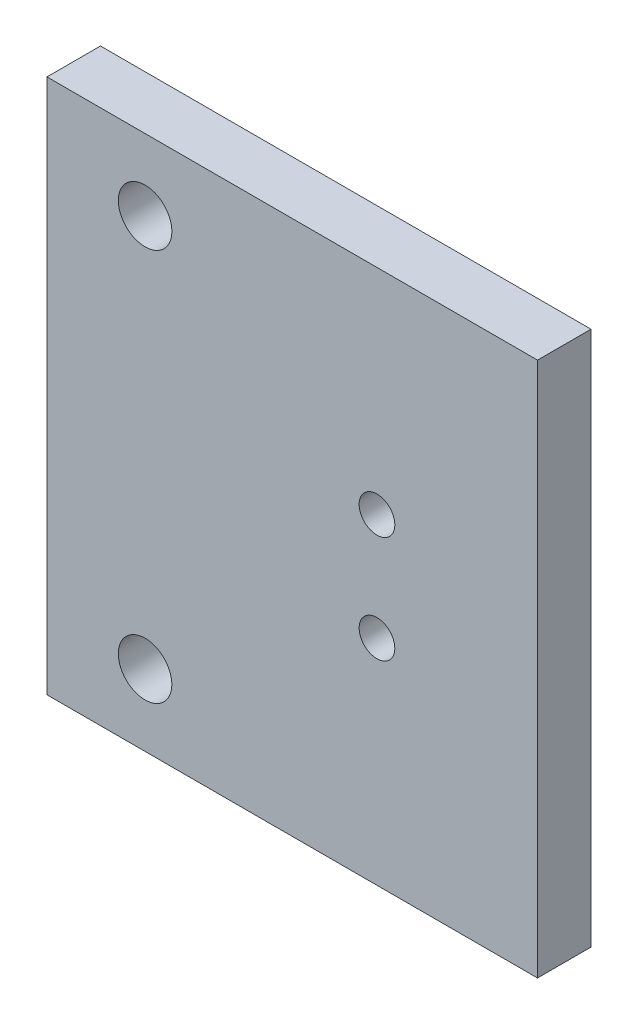
ISO-10303-21;
HEADER;
FILE_DESCRIPTION(('STEP AP214'),'2;1');
FILE_NAME('part.step','',(''),(''),'','','');
FILE_SCHEMA(('AUTOMOTIVE_DESIGN { 1 0 10303 214 1 1 1 1 }'));
ENDSEC;
DATA;
#1=APPLICATION_CONTEXT('core data for automotive mechanical design processes');
#2=APPLICATION_PROTOCOL_DEFINITION('international standard','automotive_design',2000,#1);
#3=PRODUCT_CONTEXT('',#1,'mechanical');
#4=PRODUCT('Part','Part','',(#3));
#5=PRODUCT_RELATED_PRODUCT_CATEGORY('part','',(#4));
#6=PRODUCT_DEFINITION_FORMATION('','',#4);
#7=PRODUCT_DEFINITION_CONTEXT('part definition',#1,'design');
#8=PRODUCT_DEFINITION('design','',#6,#7);
#9=PRODUCT_DEFINITION_SHAPE('','',#8);
#10=(LENGTH_UNIT() NAMED_UNIT(*) SI_UNIT(.MILLI.,.METRE.));
#11=(NAMED_UNIT(*) PLANE_ANGLE_UNIT() SI_UNIT($,.RADIAN.));
#12=(NAMED_UNIT(*) SI_UNIT($,.STERADIAN.) SOLID_ANGLE_UNIT());
#13=UNCERTAINTY_MEASURE_WITH_UNIT(LENGTH_MEASURE(1.E-05),#10,'distance_accuracy_value','');
#14=(GEOMETRIC_REPRESENTATION_CONTEXT(3) GLOBAL_UNCERTAINTY_ASSIGNED_CONTEXT((#13)) GLOBAL_UNIT_ASSIGNED_CONTEXT((#10,
#11,#12)) REPRESENTATION_CONTEXT('',''));
#15=CARTESIAN_POINT('',(0.,0.,0.));
#16=DIRECTION('',(0.,0.,1.));
#17=DIRECTION('',(1.,0.,0.));
#18=AXIS2_PLACEMENT_3D('',#15,#16,#17);
#19=CARTESIAN_POINT('',(0.,0.,3.));
#20=DIRECTION('',(0.,0.,-1.));
#21=DIRECTION('',(-1.,0.,0.));
#22=AXIS2_PLACEMENT_3D('',#19,#20,#21);
#23=PLANE('',#22);
#24=DIRECTION('',(0.,-1.,0.));
#25=VECTOR('',#24,1.);
#26=CARTESIAN_POINT('',(0.,0.,3.));
#27=LINE('',#26,#25);
#28=CARTESIAN_POINT('',(0.,30.,3.));
#29=VERTEX_POINT('',#28);
#30=CARTESIAN_POINT('',(0.,0.,3.));
#31=VERTEX_POINT('',#30);
#32=EDGE_CURVE('E85',#29,#31,#27,.T.);
#33=ORIENTED_EDGE('',*,*,#32,.T.);
#34=DIRECTION('',(1.,0.,0.));
#35=VECTOR('',#34,1.);
#36=CARTESIAN_POINT('',(0.,0.,3.));
#37=LINE('',#36,#35);
#38=CARTESIAN_POINT('',(27.5,0.,3.));
#39=VERTEX_POINT('',#38);
#40=EDGE_CURVE('E80',#31,#39,#37,.T.);
#41=ORIENTED_EDGE('',*,*,#40,.T.);
#42=DIRECTION('',(0.,1.,0.));
#43=VECTOR('',#42,1.);
#44=CARTESIAN_POINT('',(27.5,0.,3.));
#45=LINE('',#44,#43);
#46=CARTESIAN_POINT('',(27.5,30.,3.));
#47=VERTEX_POINT('',#46);
#48=EDGE_CURVE('E83',#39,#47,#45,.T.);
#49=ORIENTED_EDGE('',*,*,#48,.T.);
#50=DIRECTION('',(-1.,0.,0.));
#51=VECTOR('',#50,1.);
#52=CARTESIAN_POINT('',(0.,30.,3.));
#53=LINE('',#52,#51);
#54=EDGE_CURVE('E50',#47,#29,#53,.T.);
#55=ORIENTED_EDGE('',*,*,#54,.T.);
#56=EDGE_LOOP('',(#33,#41,#49,#55));
#57=FACE_BOUND('',#56,.T.);
#58=CARTESIAN_POINT('',(18.5,12.,3.));
#59=DIRECTION('',(0.,0.,1.));
#60=DIRECTION('',(1.,0.,0.));
#61=AXIS2_PLACEMENT_3D('',#58,#59,#60);
#62=CIRCLE('',#61,1.);
#63=CARTESIAN_POINT('',(19.5,12.,3.));
#64=VERTEX_POINT('',#63);
#65=EDGE_CURVE('E100',#64,#64,#62,.T.);
#66=ORIENTED_EDGE('',*,*,#65,.F.);
#67=EDGE_LOOP('',(#66));
#68=FACE_BOUND('',#67,.T.);
#69=CARTESIAN_POINT('',(18.5,18.,3.));
#70=DIRECTION('',(0.,0.,1.));
#71=DIRECTION('',(1.,0.,0.));
#72=AXIS2_PLACEMENT_3D('',#69,#70,#71);
#73=CIRCLE('',#72,1.);
#74=CARTESIAN_POINT('',(19.5,18.,3.));
#75=VERTEX_POINT('',#74);
#76=EDGE_CURVE('E115',#75,#75,#73,.T.);
#77=ORIENTED_EDGE('',*,*,#76,.F.);
#78=EDGE_LOOP('',(#77));
#79=FACE_BOUND('',#78,.T.);
#80=CARTESIAN_POINT('',(5.5,4.,3.));
#81=DIRECTION('',(0.,0.,1.));
#82=DIRECTION('',(1.,0.,0.));
#83=AXIS2_PLACEMENT_3D('',#80,#81,#82);
#84=CIRCLE('',#83,1.5);
#85=CARTESIAN_POINT('',(7.,4.,3.));
#86=VERTEX_POINT('',#85);
#87=EDGE_CURVE('E121',#86,#86,#84,.T.);
#88=ORIENTED_EDGE('',*,*,#87,.F.);
#89=EDGE_LOOP('',(#88));
#90=FACE_BOUND('',#89,.T.);
#91=CARTESIAN_POINT('',(5.5,26.,3.));
#92=DIRECTION('',(0.,0.,1.));
#93=DIRECTION('',(-1.,0.,0.));
#94=AXIS2_PLACEMENT_3D('',#91,#92,#93);
#95=CIRCLE('',#94,1.5);
#96=CARTESIAN_POINT('',(4.,26.,3.));
#97=VERTEX_POINT('',#96);
#98=EDGE_CURVE('E127',#97,#97,#95,.T.);
#99=ORIENTED_EDGE('',*,*,#98,.F.);
#100=EDGE_LOOP('',(#99));
#101=FACE_BOUND('',#100,.T.);
#102=ADVANCED_FACE('F33',(#57,#68,#79,#90,#101),#23,.F.);
#103=CARTESIAN_POINT('',(0.,0.,0.));
#104=DIRECTION('',(0.,0.,-1.));
#105=DIRECTION('',(-1.,0.,0.));
#106=AXIS2_PLACEMENT_3D('',#103,#104,#105);
#107=PLANE('',#106);
#108=CARTESIAN_POINT('',(5.5,4.,0.));
#109=DIRECTION('',(0.,0.,1.));
#110=DIRECTION('',(1.,0.,0.));
#111=AXIS2_PLACEMENT_3D('',#108,#109,#110);
#112=CIRCLE('',#111,1.5);
#113=CARTESIAN_POINT('',(7.,4.,0.));
#114=VERTEX_POINT('',#113);
#115=EDGE_CURVE('E124',#114,#114,#112,.T.);
#116=ORIENTED_EDGE('',*,*,#115,.T.);
#117=EDGE_LOOP('',(#116));
#118=FACE_BOUND('',#117,.T.);
#119=CARTESIAN_POINT('',(18.5,12.,0.));
#120=DIRECTION('',(0.,0.,1.));
#121=DIRECTION('',(1.,0.,0.));
#122=AXIS2_PLACEMENT_3D('',#119,#120,#121);
#123=CIRCLE('',#122,1.);
#124=CARTESIAN_POINT('',(19.5,12.,0.));
#125=VERTEX_POINT('',#124);
#126=EDGE_CURVE('E112',#125,#125,#123,.T.);
#127=ORIENTED_EDGE('',*,*,#126,.T.);
#128=EDGE_LOOP('',(#127));
#129=FACE_BOUND('',#128,.T.);
#130=DIRECTION('',(0.,-1.,0.));
#131=VECTOR('',#130,1.);
#132=CARTESIAN_POINT('',(0.,0.,0.));
#133=LINE('',#132,#131);
#134=CARTESIAN_POINT('',(0.,30.,0.));
#135=VERTEX_POINT('',#134);
#136=CARTESIAN_POINT('',(0.,0.,0.));
#137=VERTEX_POINT('',#136);
#138=EDGE_CURVE('E97',#135,#137,#133,.T.);
#139=ORIENTED_EDGE('',*,*,#138,.F.);
#140=DIRECTION('',(-1.,0.,0.));
#141=VECTOR('',#140,1.);
#142=CARTESIAN_POINT('',(0.,30.,0.));
#143=LINE('',#142,#141);
#144=CARTESIAN_POINT('',(27.5,30.,0.));
#145=VERTEX_POINT('',#144);
#146=EDGE_CURVE('E73',#145,#135,#143,.T.);
#147=ORIENTED_EDGE('',*,*,#146,.F.);
#148=DIRECTION('',(0.,1.,0.));
#149=VECTOR('',#148,1.);
#150=CARTESIAN_POINT('',(27.5,0.,0.));
#151=LINE('',#150,#149);
#152=CARTESIAN_POINT('',(27.5,0.,0.));
#153=VERTEX_POINT('',#152);
#154=EDGE_CURVE('E67',#153,#145,#151,.T.);
#155=ORIENTED_EDGE('',*,*,#154,.F.);
#156=DIRECTION('',(1.,0.,0.));
#157=VECTOR('',#156,1.);
#158=CARTESIAN_POINT('',(0.,0.,0.));
#159=LINE('',#158,#157);
#160=EDGE_CURVE('E89',#137,#153,#159,.T.);
#161=ORIENTED_EDGE('',*,*,#160,.F.);
#162=EDGE_LOOP('',(#139,#147,#155,#161));
#163=FACE_BOUND('',#162,.T.);
#164=CARTESIAN_POINT('',(18.5,18.,0.));
#165=DIRECTION('',(0.,0.,1.));
#166=DIRECTION('',(1.,0.,0.));
#167=AXIS2_PLACEMENT_3D('',#164,#165,#166);
#168=CIRCLE('',#167,1.);
#169=CARTESIAN_POINT('',(19.5,18.,0.));
#170=VERTEX_POINT('',#169);
#171=EDGE_CURVE('E118',#170,#170,#168,.T.);
#172=ORIENTED_EDGE('',*,*,#171,.T.);
#173=EDGE_LOOP('',(#172));
#174=FACE_BOUND('',#173,.T.);
#175=CARTESIAN_POINT('',(5.5,26.,0.));
#176=DIRECTION('',(0.,0.,1.));
#177=DIRECTION('',(-1.,0.,0.));
#178=AXIS2_PLACEMENT_3D('',#175,#176,#177);
#179=CIRCLE('',#178,1.5);
#180=CARTESIAN_POINT('',(4.,26.,0.));
#181=VERTEX_POINT('',#180);
#182=EDGE_CURVE('E130',#181,#181,#179,.T.);
#183=ORIENTED_EDGE('',*,*,#182,.T.);
#184=EDGE_LOOP('',(#183));
#185=FACE_BOUND('',#184,.T.);
#186=ADVANCED_FACE('F108',(#118,#129,#163,#174,#185),#107,.T.);
#187=CARTESIAN_POINT('',(0.,0.,3.));
#188=DIRECTION('',(1.,0.,0.));
#189=DIRECTION('',(0.,0.,-1.));
#190=AXIS2_PLACEMENT_3D('',#187,#188,#189);
#191=PLANE('',#190);
#192=ORIENTED_EDGE('',*,*,#138,.T.);
#193=DIRECTION('',(0.,0.,-1.));
#194=VECTOR('',#193,1.);
#195=CARTESIAN_POINT('',(0.,0.,3.));
#196=LINE('',#195,#194);
#197=EDGE_CURVE('E11',#31,#137,#196,.T.);
#198=ORIENTED_EDGE('',*,*,#197,.F.);
#199=ORIENTED_EDGE('',*,*,#32,.F.);
#200=DIRECTION('',(0.,0.,-1.));
#201=VECTOR('',#200,1.);
#202=CARTESIAN_POINT('',(0.,30.,3.));
#203=LINE('',#202,#201);
#204=EDGE_CURVE('E93',#29,#135,#203,.T.);
#205=ORIENTED_EDGE('',*,*,#204,.T.);
#206=EDGE_LOOP('',(#192,#198,#199,#205));
#207=FACE_BOUND('',#206,.T.);
#208=ADVANCED_FACE('F35',(#207),#191,.F.);
#209=CARTESIAN_POINT('',(0.,0.,3.));
#210=DIRECTION('',(0.,1.,0.));
#211=DIRECTION('',(0.,0.,1.));
#212=AXIS2_PLACEMENT_3D('',#209,#210,#211);
#213=PLANE('',#212);
#214=ORIENTED_EDGE('',*,*,#160,.T.);
#215=DIRECTION('',(0.,0.,-1.));
#216=VECTOR('',#215,1.);
#217=CARTESIAN_POINT('',(27.5,0.,3.));
#218=LINE('',#217,#216);
#219=EDGE_CURVE('E42',#39,#153,#218,.T.);
#220=ORIENTED_EDGE('',*,*,#219,.F.);
#221=ORIENTED_EDGE('',*,*,#40,.F.);
#222=ORIENTED_EDGE('',*,*,#197,.T.);
#223=EDGE_LOOP('',(#214,#220,#221,#222));
#224=FACE_BOUND('',#223,.T.);
#225=ADVANCED_FACE('F88',(#224),#213,.F.);
#226=CARTESIAN_POINT('',(27.5,0.,3.));
#227=DIRECTION('',(-1.,0.,0.));
#228=DIRECTION('',(0.,0.,1.));
#229=AXIS2_PLACEMENT_3D('',#226,#227,#228);
#230=PLANE('',#229);
#231=ORIENTED_EDGE('',*,*,#154,.T.);
#232=DIRECTION('',(0.,0.,-1.));
#233=VECTOR('',#232,1.);
#234=CARTESIAN_POINT('',(27.5,30.,3.));
#235=LINE('',#234,#233);
#236=EDGE_CURVE('E90',#47,#145,#235,.T.);
#237=ORIENTED_EDGE('',*,*,#236,.F.);
#238=ORIENTED_EDGE('',*,*,#48,.F.);
#239=ORIENTED_EDGE('',*,*,#219,.T.);
#240=EDGE_LOOP('',(#231,#237,#238,#239));
#241=FACE_BOUND('',#240,.T.);
#242=ADVANCED_FACE('F91',(#241),#230,.F.);
#243=CARTESIAN_POINT('',(0.,30.,3.));
#244=DIRECTION('',(0.,-1.,0.));
#245=DIRECTION('',(0.,0.,-1.));
#246=AXIS2_PLACEMENT_3D('',#243,#244,#245);
#247=PLANE('',#246);
#248=ORIENTED_EDGE('',*,*,#146,.T.);
#249=ORIENTED_EDGE('',*,*,#204,.F.);
#250=ORIENTED_EDGE('',*,*,#54,.F.);
#251=ORIENTED_EDGE('',*,*,#236,.T.);
#252=EDGE_LOOP('',(#248,#249,#250,#251));
#253=FACE_BOUND('',#252,.T.);
#254=ADVANCED_FACE('F105',(#253),#247,.F.);
#255=CARTESIAN_POINT('',(18.5,12.,3.));
#256=DIRECTION('',(0.,0.,-1.));
#257=DIRECTION('',(-1.,0.,0.));
#258=AXIS2_PLACEMENT_3D('',#255,#256,#257);
#259=CYLINDRICAL_SURFACE('',#258,1.);
#260=ORIENTED_EDGE('',*,*,#65,.T.);
#261=EDGE_LOOP('',(#260));
#262=FACE_BOUND('',#261,.T.);
#263=ORIENTED_EDGE('',*,*,#126,.F.);
#264=EDGE_LOOP('',(#263));
#265=FACE_BOUND('',#264,.T.);
#266=ADVANCED_FACE('F147',(#262,#265),#259,.F.);
#267=CARTESIAN_POINT('',(18.5,18.,3.));
#268=DIRECTION('',(0.,0.,-1.));
#269=DIRECTION('',(-1.,0.,0.));
#270=AXIS2_PLACEMENT_3D('',#267,#268,#269);
#271=CYLINDRICAL_SURFACE('',#270,1.);
#272=ORIENTED_EDGE('',*,*,#76,.T.);
#273=EDGE_LOOP('',(#272));
#274=FACE_BOUND('',#273,.T.);
#275=ORIENTED_EDGE('',*,*,#171,.F.);
#276=EDGE_LOOP('',(#275));
#277=FACE_BOUND('',#276,.T.);
#278=ADVANCED_FACE('F193',(#274,#277),#271,.F.);
#279=CARTESIAN_POINT('',(5.5,4.,3.));
#280=DIRECTION('',(0.,0.,-1.));
#281=DIRECTION('',(-1.,0.,0.));
#282=AXIS2_PLACEMENT_3D('',#279,#280,#281);
#283=CYLINDRICAL_SURFACE('',#282,1.5);
#284=ORIENTED_EDGE('',*,*,#87,.T.);
#285=EDGE_LOOP('',(#284));
#286=FACE_BOUND('',#285,.T.);
#287=ORIENTED_EDGE('',*,*,#115,.F.);
#288=EDGE_LOOP('',(#287));
#289=FACE_BOUND('',#288,.T.);
#290=ADVANCED_FACE('F201',(#286,#289),#283,.F.);
#291=CARTESIAN_POINT('',(5.5,26.,3.));
#292=DIRECTION('',(0.,0.,-1.));
#293=DIRECTION('',(-1.,0.,0.));
#294=AXIS2_PLACEMENT_3D('',#291,#292,#293);
#295=CYLINDRICAL_SURFACE('',#294,1.5);
#296=ORIENTED_EDGE('',*,*,#98,.T.);
#297=EDGE_LOOP('',(#296));
#298=FACE_BOUND('',#297,.T.);
#299=ORIENTED_EDGE('',*,*,#182,.F.);
#300=EDGE_LOOP('',(#299));
#301=FACE_BOUND('',#300,.T.);
#302=ADVANCED_FACE('F136',(#298,#301),#295,.F.);
#303=CLOSED_SHELL('',(#102,#186,#208,#225,#242,#254,#266,#278,#290,#302));
#304=MANIFOLD_SOLID_BREP('B2',#303);
#305=ADVANCED_BREP_SHAPE_REPRESENTATION('',(#18,#304),#14);
#306=SHAPE_DEFINITION_REPRESENTATION(#9,#305);
ENDSEC;
END-ISO-10303-21;
